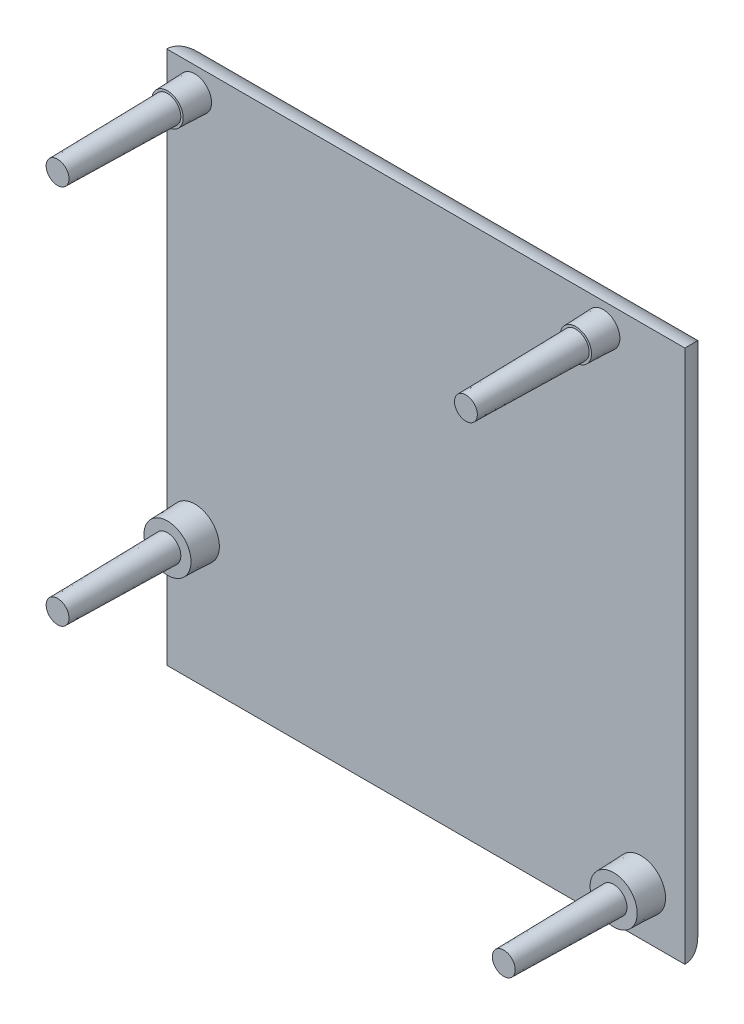
ISO-10303-21;
HEADER;
FILE_DESCRIPTION(('STEP AP214'),'2;1');
FILE_NAME('part.step','',(''),(''),'','','');
FILE_SCHEMA(('AUTOMOTIVE_DESIGN { 1 0 10303 214 1 1 1 1 }'));
ENDSEC;
DATA;
#1=APPLICATION_CONTEXT('core data for automotive mechanical design processes');
#2=APPLICATION_PROTOCOL_DEFINITION('international standard','automotive_design',2000,#1);
#3=PRODUCT_CONTEXT('',#1,'mechanical');
#4=PRODUCT('Part','Part','',(#3));
#5=PRODUCT_RELATED_PRODUCT_CATEGORY('part','',(#4));
#6=PRODUCT_DEFINITION_FORMATION('','',#4);
#7=PRODUCT_DEFINITION_CONTEXT('part definition',#1,'design');
#8=PRODUCT_DEFINITION('design','',#6,#7);
#9=PRODUCT_DEFINITION_SHAPE('','',#8);
#10=(LENGTH_UNIT() NAMED_UNIT(*) SI_UNIT(.MILLI.,.METRE.));
#11=(NAMED_UNIT(*) PLANE_ANGLE_UNIT() SI_UNIT($,.RADIAN.));
#12=(NAMED_UNIT(*) SI_UNIT($,.STERADIAN.) SOLID_ANGLE_UNIT());
#13=UNCERTAINTY_MEASURE_WITH_UNIT(LENGTH_MEASURE(1.E-05),#10,'distance_accuracy_value','');
#14=(GEOMETRIC_REPRESENTATION_CONTEXT(3) GLOBAL_UNCERTAINTY_ASSIGNED_CONTEXT((#13)) GLOBAL_UNIT_ASSIGNED_CONTEXT((#10,
#11,#12)) REPRESENTATION_CONTEXT('',''));
#15=CARTESIAN_POINT('',(0.,0.,0.));
#16=DIRECTION('',(0.,0.,1.));
#17=DIRECTION('',(1.,0.,0.));
#18=AXIS2_PLACEMENT_3D('',#15,#16,#17);
#19=CARTESIAN_POINT('',(0.,0.,2.));
#20=DIRECTION('',(0.,0.,-1.));
#21=DIRECTION('',(-1.,0.,0.));
#22=AXIS2_PLACEMENT_3D('',#19,#20,#21);
#23=PLANE('',#22);
#24=CARTESIAN_POINT('',(11.3,15.46,2.));
#25=DIRECTION('',(0.,0.,-1.));
#26=DIRECTION('',(-1.,0.,0.));
#27=AXIS2_PLACEMENT_3D('',#24,#25,#26);
#28=CIRCLE('',#27,1.06097166353259);
#29=CARTESIAN_POINT('',(10.2390283364674,15.46,2.));
#30=VERTEX_POINT('',#29);
#31=EDGE_CURVE('E141',#30,#30,#28,.F.);
#32=ORIENTED_EDGE('',*,*,#31,.F.);
#33=EDGE_LOOP('',(#32));
#34=FACE_BOUND('',#33,.T.);
#35=CARTESIAN_POINT('',(-14.71,15.46,2.));
#36=DIRECTION('',(0.,0.,-1.));
#37=DIRECTION('',(-1.,0.,0.));
#38=AXIS2_PLACEMENT_3D('',#35,#36,#37);
#39=CIRCLE('',#38,1.06097166353259);
#40=CARTESIAN_POINT('',(-15.7709716635326,15.46,2.));
#41=VERTEX_POINT('',#40);
#42=EDGE_CURVE('E134',#41,#41,#39,.F.);
#43=ORIENTED_EDGE('',*,*,#42,.F.);
#44=EDGE_LOOP('',(#43));
#45=FACE_BOUND('',#44,.T.);
#46=CARTESIAN_POINT('',(-14.71,-8.77,2.));
#47=DIRECTION('',(0.,0.,-1.));
#48=DIRECTION('',(-1.,0.,0.));
#49=AXIS2_PLACEMENT_3D('',#46,#47,#48);
#50=CIRCLE('',#49,1.56097166353259);
#51=CARTESIAN_POINT('',(-16.2709716635326,-8.77,2.));
#52=VERTEX_POINT('',#51);
#53=EDGE_CURVE('E150',#52,#52,#50,.F.);
#54=ORIENTED_EDGE('',*,*,#53,.F.);
#55=EDGE_LOOP('',(#54));
#56=FACE_BOUND('',#55,.T.);
#57=CARTESIAN_POINT('',(13.71,-13.96,2.));
#58=DIRECTION('',(0.,0.,-1.));
#59=DIRECTION('',(-1.,0.,0.));
#60=AXIS2_PLACEMENT_3D('',#57,#58,#59);
#61=CIRCLE('',#60,1.56097166353259);
#62=CARTESIAN_POINT('',(12.1490283364674,-13.96,2.));
#63=VERTEX_POINT('',#62);
#64=EDGE_CURVE('E97',#63,#63,#61,.F.);
#65=ORIENTED_EDGE('',*,*,#64,.F.);
#66=EDGE_LOOP('',(#65));
#67=FACE_BOUND('',#66,.T.);
#68=DIRECTION('',(1.,0.,0.));
#69=VECTOR('',#68,1.);
#70=CARTESIAN_POINT('',(-16.5,17.,2.));
#71=LINE('',#70,#69);
#72=CARTESIAN_POINT('',(-16.5,17.,2.));
#73=VERTEX_POINT('',#72);
#74=CARTESIAN_POINT('',(16.5,17.,2.));
#75=VERTEX_POINT('',#74);
#76=EDGE_CURVE('E79',#73,#75,#71,.T.);
#77=ORIENTED_EDGE('',*,*,#76,.F.);
#78=DIRECTION('',(0.,-1.,0.));
#79=VECTOR('',#78,1.);
#80=CARTESIAN_POINT('',(-16.5,17.,2.));
#81=LINE('',#80,#79);
#82=CARTESIAN_POINT('',(-16.5,-17.,2.));
#83=VERTEX_POINT('',#82);
#84=EDGE_CURVE('E101',#73,#83,#81,.T.);
#85=ORIENTED_EDGE('',*,*,#84,.T.);
#86=DIRECTION('',(1.,0.,0.));
#87=VECTOR('',#86,1.);
#88=CARTESIAN_POINT('',(-16.5,-17.,2.));
#89=LINE('',#88,#87);
#90=CARTESIAN_POINT('',(16.5,-17.,2.));
#91=VERTEX_POINT('',#90);
#92=EDGE_CURVE('E82',#83,#91,#89,.T.);
#93=ORIENTED_EDGE('',*,*,#92,.T.);
#94=DIRECTION('',(0.,-1.,0.));
#95=VECTOR('',#94,1.);
#96=CARTESIAN_POINT('',(16.5,17.,2.));
#97=LINE('',#96,#95);
#98=EDGE_CURVE('E75',#75,#91,#97,.T.);
#99=ORIENTED_EDGE('',*,*,#98,.F.);
#100=EDGE_LOOP('',(#77,#85,#93,#99));
#101=FACE_BOUND('',#100,.T.);
#102=ADVANCED_FACE('F35',(#34,#45,#56,#67,#101),#23,.F.);
#103=CARTESIAN_POINT('',(0.,0.,0.));
#104=DIRECTION('',(0.,0.,-1.));
#105=DIRECTION('',(-1.,0.,0.));
#106=AXIS2_PLACEMENT_3D('',#103,#104,#105);
#107=PLANE('',#106);
#108=DIRECTION('',(1.,0.,0.));
#109=VECTOR('',#108,1.);
#110=CARTESIAN_POINT('',(-16.5,-15.,0.));
#111=LINE('',#110,#109);
#112=CARTESIAN_POINT('',(14.5,-15.,0.));
#113=VERTEX_POINT('',#112);
#114=CARTESIAN_POINT('',(-14.5,-15.,0.));
#115=VERTEX_POINT('',#114);
#116=EDGE_CURVE('E50',#113,#115,#111,.F.);
#117=ORIENTED_EDGE('',*,*,#116,.T.);
#118=DIRECTION('',(0.,-1.,0.));
#119=VECTOR('',#118,1.);
#120=CARTESIAN_POINT('',(-14.5,17.,0.));
#121=LINE('',#120,#119);
#122=CARTESIAN_POINT('',(-14.5,15.,0.));
#123=VERTEX_POINT('',#122);
#124=EDGE_CURVE('E107',#115,#123,#121,.F.);
#125=ORIENTED_EDGE('',*,*,#124,.T.);
#126=DIRECTION('',(1.,0.,0.));
#127=VECTOR('',#126,1.);
#128=CARTESIAN_POINT('',(0.,15.,0.));
#129=LINE('',#128,#127);
#130=CARTESIAN_POINT('',(14.5,15.,0.));
#131=VERTEX_POINT('',#130);
#132=EDGE_CURVE('E103',#123,#131,#129,.T.);
#133=ORIENTED_EDGE('',*,*,#132,.T.);
#134=DIRECTION('',(0.,-1.,0.));
#135=VECTOR('',#134,1.);
#136=CARTESIAN_POINT('',(14.5,0.,0.));
#137=LINE('',#136,#135);
#138=EDGE_CURVE('E55',#131,#113,#137,.T.);
#139=ORIENTED_EDGE('',*,*,#138,.T.);
#140=EDGE_LOOP('',(#117,#125,#133,#139));
#141=FACE_BOUND('',#140,.T.);
#142=ADVANCED_FACE('F165',(#141),#107,.T.);
#143=CARTESIAN_POINT('',(14.5,0.,2.));
#144=DIRECTION('',(0.,-1.,0.));
#145=DIRECTION('',(1.,0.,0.));
#146=AXIS2_PLACEMENT_3D('',#143,#144,#145);
#147=CYLINDRICAL_SURFACE('',#146,2.);
#148=CARTESIAN_POINT('',(14.5,-15.,2.));
#149=DIRECTION('',(-0.707106781186547,-0.707106781186548,0.));
#150=DIRECTION('',(0.707106781186548,-0.707106781186547,0.));
#151=AXIS2_PLACEMENT_3D('',#148,#149,#150);
#152=ELLIPSE('',#151,2.82842712474619,2.);
#153=EDGE_CURVE('E90',#113,#91,#152,.T.);
#154=ORIENTED_EDGE('',*,*,#153,.F.);
#155=ORIENTED_EDGE('',*,*,#138,.F.);
#156=CARTESIAN_POINT('',(14.5,15.,2.));
#157=DIRECTION('',(0.707106781186548,-0.707106781186547,0.));
#158=DIRECTION('',(0.707106781186547,0.707106781186548,0.));
#159=AXIS2_PLACEMENT_3D('',#156,#157,#158);
#160=ELLIPSE('',#159,2.82842712474619,2.);
#161=EDGE_CURVE('E87',#75,#131,#160,.F.);
#162=ORIENTED_EDGE('',*,*,#161,.F.);
#163=ORIENTED_EDGE('',*,*,#98,.T.);
#164=EDGE_LOOP('',(#154,#155,#162,#163));
#165=FACE_BOUND('',#164,.T.);
#166=ADVANCED_FACE('F37',(#165),#147,.T.);
#167=CARTESIAN_POINT('',(0.,15.,2.));
#168=DIRECTION('',(1.,0.,0.));
#169=DIRECTION('',(0.,0.,-1.));
#170=AXIS2_PLACEMENT_3D('',#167,#168,#169);
#171=CYLINDRICAL_SURFACE('',#170,2.);
#172=ORIENTED_EDGE('',*,*,#161,.T.);
#173=ORIENTED_EDGE('',*,*,#132,.F.);
#174=CARTESIAN_POINT('',(-14.5,15.,2.));
#175=DIRECTION('',(0.707106781186547,0.707106781186548,0.));
#176=DIRECTION('',(0.707106781186548,-0.707106781186547,0.));
#177=AXIS2_PLACEMENT_3D('',#174,#175,#176);
#178=ELLIPSE('',#177,2.82842712474619,2.);
#179=EDGE_CURVE('E93',#73,#123,#178,.F.);
#180=ORIENTED_EDGE('',*,*,#179,.F.);
#181=ORIENTED_EDGE('',*,*,#76,.T.);
#182=EDGE_LOOP('',(#172,#173,#180,#181));
#183=FACE_BOUND('',#182,.T.);
#184=ADVANCED_FACE('F92',(#183),#171,.T.);
#185=CARTESIAN_POINT('',(-16.5,-15.,2.));
#186=DIRECTION('',(-1.,0.,0.));
#187=DIRECTION('',(0.,0.,1.));
#188=AXIS2_PLACEMENT_3D('',#185,#186,#187);
#189=CYLINDRICAL_SURFACE('',#188,2.);
#190=ORIENTED_EDGE('',*,*,#153,.T.);
#191=ORIENTED_EDGE('',*,*,#92,.F.);
#192=CARTESIAN_POINT('',(-14.5,-15.,2.));
#193=DIRECTION('',(-0.707106781186548,0.707106781186547,0.));
#194=DIRECTION('',(-0.707106781186547,-0.707106781186548,0.));
#195=AXIS2_PLACEMENT_3D('',#192,#193,#194);
#196=ELLIPSE('',#195,2.82842712474619,2.);
#197=EDGE_CURVE('E110',#115,#83,#196,.T.);
#198=ORIENTED_EDGE('',*,*,#197,.F.);
#199=ORIENTED_EDGE('',*,*,#116,.F.);
#200=EDGE_LOOP('',(#190,#191,#198,#199));
#201=FACE_BOUND('',#200,.T.);
#202=ADVANCED_FACE('F181',(#201),#189,.T.);
#203=CARTESIAN_POINT('',(-14.5,17.,2.));
#204=DIRECTION('',(0.,1.,0.));
#205=DIRECTION('',(-1.,0.,0.));
#206=AXIS2_PLACEMENT_3D('',#203,#204,#205);
#207=CYLINDRICAL_SURFACE('',#206,2.);
#208=ORIENTED_EDGE('',*,*,#179,.T.);
#209=ORIENTED_EDGE('',*,*,#124,.F.);
#210=ORIENTED_EDGE('',*,*,#197,.T.);
#211=ORIENTED_EDGE('',*,*,#84,.F.);
#212=EDGE_LOOP('',(#208,#209,#210,#211));
#213=FACE_BOUND('',#212,.T.);
#214=ADVANCED_FACE('F177',(#213),#207,.T.);
#215=CARTESIAN_POINT('',(13.71,-13.96,3.74600000000003));
#216=DIRECTION('',(0.,0.,1.));
#217=DIRECTION('',(-0.894427190999916,0.447213595499958,0.));
#218=AXIS2_PLACEMENT_3D('',#215,#216,#217);
#219=PLANE('',#218);
#220=CARTESIAN_POINT('',(13.71,-13.96,3.74600000000003));
#221=DIRECTION('',(0.,0.,1.));
#222=DIRECTION('',(1.,0.,0.));
#223=AXIS2_PLACEMENT_3D('',#220,#221,#222);
#224=CIRCLE('',#223,0.85);
#225=CARTESIAN_POINT('',(14.56,-13.96,3.74600000000003));
#226=VERTEX_POINT('',#225);
#227=EDGE_CURVE('E109',#226,#226,#224,.T.);
#228=ORIENTED_EDGE('',*,*,#227,.F.);
#229=EDGE_LOOP('',(#228));
#230=FACE_BOUND('',#229,.T.);
#231=CARTESIAN_POINT('',(13.71,-13.96,3.74600000000003));
#232=DIRECTION('',(0.,0.,-1.));
#233=DIRECTION('',(0.894427190999916,-0.447213595499958,0.));
#234=AXIS2_PLACEMENT_3D('',#231,#232,#233);
#235=CIRCLE('',#234,1.5);
#236=CARTESIAN_POINT('',(15.0516407864999,-14.6308203932499,3.74600000000003));
#237=VERTEX_POINT('',#236);
#238=EDGE_CURVE('E155',#237,#237,#235,.T.);
#239=ORIENTED_EDGE('',*,*,#238,.F.);
#240=EDGE_LOOP('',(#239));
#241=FACE_BOUND('',#240,.T.);
#242=ADVANCED_FACE('F180',(#230,#241),#219,.T.);
#243=CARTESIAN_POINT('',(13.71,-13.96,3.74600000000003));
#244=DIRECTION('',(0.,0.,-1.));
#245=DIRECTION('',(0.894427190999916,-0.447213595499958,0.));
#246=AXIS2_PLACEMENT_3D('',#243,#244,#245);
#247=CONICAL_SURFACE('',#246,1.5,0.0349065850398865);
#248=ORIENTED_EDGE('',*,*,#238,.T.);
#249=EDGE_LOOP('',(#248));
#250=FACE_BOUND('',#249,.T.);
#251=ORIENTED_EDGE('',*,*,#64,.T.);
#252=EDGE_LOOP('',(#251));
#253=FACE_BOUND('',#252,.T.);
#254=ADVANCED_FACE('F162',(#250,#253),#247,.T.);
#255=CARTESIAN_POINT('',(13.71,-13.96,10.746));
#256=DIRECTION('',(0.,0.,1.));
#257=DIRECTION('',(-0.894427190999916,0.447213595499958,0.));
#258=AXIS2_PLACEMENT_3D('',#255,#256,#257);
#259=PLANE('',#258);
#260=CARTESIAN_POINT('',(13.71,-13.96,10.746));
#261=DIRECTION('',(0.,0.,-1.));
#262=DIRECTION('',(0.894427190999916,-0.447213595499958,0.));
#263=AXIS2_PLACEMENT_3D('',#260,#261,#262);
#264=CIRCLE('',#263,0.727814545502465);
#265=CARTESIAN_POINT('',(14.3609771195026,-14.2854885597513,10.746));
#266=VERTEX_POINT('',#265);
#267=EDGE_CURVE('E153',#266,#266,#264,.T.);
#268=ORIENTED_EDGE('',*,*,#267,.F.);
#269=EDGE_LOOP('',(#268));
#270=FACE_BOUND('',#269,.T.);
#271=ADVANCED_FACE('F231',(#270),#259,.T.);
#272=CARTESIAN_POINT('',(13.71,-13.96,10.746));
#273=DIRECTION('',(0.,0.,-1.));
#274=DIRECTION('',(0.894427190999916,-0.447213595499958,0.));
#275=AXIS2_PLACEMENT_3D('',#272,#273,#274);
#276=CONICAL_SURFACE('',#275,0.727814545502465,0.0174532925199449);
#277=ORIENTED_EDGE('',*,*,#227,.T.);
#278=EDGE_LOOP('',(#277));
#279=FACE_BOUND('',#278,.T.);
#280=ORIENTED_EDGE('',*,*,#267,.T.);
#281=EDGE_LOOP('',(#280));
#282=FACE_BOUND('',#281,.T.);
#283=ADVANCED_FACE('F238',(#279,#282),#276,.T.);
#284=CARTESIAN_POINT('',(-14.71,-8.77,3.74600000000003));
#285=DIRECTION('',(0.,0.,1.));
#286=DIRECTION('',(-0.894427190999916,0.447213595499958,0.));
#287=AXIS2_PLACEMENT_3D('',#284,#285,#286);
#288=PLANE('',#287);
#289=CARTESIAN_POINT('',(-14.71,-8.77,3.74600000000003));
#290=DIRECTION('',(0.,0.,1.));
#291=DIRECTION('',(1.,0.,0.));
#292=AXIS2_PLACEMENT_3D('',#289,#290,#291);
#293=CIRCLE('',#292,0.85);
#294=CARTESIAN_POINT('',(-13.86,-8.77,3.74600000000003));
#295=VERTEX_POINT('',#294);
#296=EDGE_CURVE('E116',#295,#295,#293,.T.);
#297=ORIENTED_EDGE('',*,*,#296,.F.);
#298=EDGE_LOOP('',(#297));
#299=FACE_BOUND('',#298,.T.);
#300=CARTESIAN_POINT('',(-14.71,-8.77,3.74600000000003));
#301=DIRECTION('',(0.,0.,-1.));
#302=DIRECTION('',(0.894427190999916,-0.447213595499958,0.));
#303=AXIS2_PLACEMENT_3D('',#300,#301,#302);
#304=CIRCLE('',#303,1.5);
#305=CARTESIAN_POINT('',(-13.3683592135001,-9.44082039324994,3.74600000000003));
#306=VERTEX_POINT('',#305);
#307=EDGE_CURVE('E147',#306,#306,#304,.T.);
#308=ORIENTED_EDGE('',*,*,#307,.F.);
#309=EDGE_LOOP('',(#308));
#310=FACE_BOUND('',#309,.T.);
#311=ADVANCED_FACE('F247',(#299,#310),#288,.T.);
#312=CARTESIAN_POINT('',(-14.71,-8.77,3.74600000000003));
#313=DIRECTION('',(0.,0.,-1.));
#314=DIRECTION('',(0.894427190999916,-0.447213595499958,0.));
#315=AXIS2_PLACEMENT_3D('',#312,#313,#314);
#316=CONICAL_SURFACE('',#315,1.5,0.0349065850398865);
#317=ORIENTED_EDGE('',*,*,#307,.T.);
#318=EDGE_LOOP('',(#317));
#319=FACE_BOUND('',#318,.T.);
#320=ORIENTED_EDGE('',*,*,#53,.T.);
#321=EDGE_LOOP('',(#320));
#322=FACE_BOUND('',#321,.T.);
#323=ADVANCED_FACE('F256',(#319,#322),#316,.T.);
#324=CARTESIAN_POINT('',(-14.71,-8.77,10.746));
#325=DIRECTION('',(0.,0.,1.));
#326=DIRECTION('',(-0.894427190999916,0.447213595499958,0.));
#327=AXIS2_PLACEMENT_3D('',#324,#325,#326);
#328=PLANE('',#327);
#329=CARTESIAN_POINT('',(-14.71,-8.77,10.746));
#330=DIRECTION('',(0.,0.,-1.));
#331=DIRECTION('',(0.894427190999916,-0.447213595499958,0.));
#332=AXIS2_PLACEMENT_3D('',#329,#330,#331);
#333=CIRCLE('',#332,0.727814545502465);
#334=CARTESIAN_POINT('',(-14.0590228804973,-9.09548855975133,10.746));
#335=VERTEX_POINT('',#334);
#336=EDGE_CURVE('E138',#335,#335,#333,.T.);
#337=ORIENTED_EDGE('',*,*,#336,.F.);
#338=EDGE_LOOP('',(#337));
#339=FACE_BOUND('',#338,.T.);
#340=ADVANCED_FACE('F265',(#339),#328,.T.);
#341=CARTESIAN_POINT('',(-14.71,-8.77,10.746));
#342=DIRECTION('',(0.,0.,-1.));
#343=DIRECTION('',(0.894427190999916,-0.447213595499958,0.));
#344=AXIS2_PLACEMENT_3D('',#341,#342,#343);
#345=CONICAL_SURFACE('',#344,0.727814545502465,0.0174532925199449);
#346=ORIENTED_EDGE('',*,*,#296,.T.);
#347=EDGE_LOOP('',(#346));
#348=FACE_BOUND('',#347,.T.);
#349=ORIENTED_EDGE('',*,*,#336,.T.);
#350=EDGE_LOOP('',(#349));
#351=FACE_BOUND('',#350,.T.);
#352=ADVANCED_FACE('F128',(#348,#351),#345,.T.);
#353=CARTESIAN_POINT('',(-14.71,15.46,3.74600000000003));
#354=DIRECTION('',(0.,0.,1.));
#355=DIRECTION('',(-0.894427190999916,0.447213595499958,0.));
#356=AXIS2_PLACEMENT_3D('',#353,#354,#355);
#357=PLANE('',#356);
#358=CARTESIAN_POINT('',(-14.71,15.46,3.74600000000003));
#359=DIRECTION('',(0.,0.,1.));
#360=DIRECTION('',(1.,0.,0.));
#361=AXIS2_PLACEMENT_3D('',#358,#359,#360);
#362=CIRCLE('',#361,0.85);
#363=CARTESIAN_POINT('',(-13.86,15.46,3.74600000000003));
#364=VERTEX_POINT('',#363);
#365=EDGE_CURVE('E43',#364,#364,#362,.T.);
#366=ORIENTED_EDGE('',*,*,#365,.F.);
#367=EDGE_LOOP('',(#366));
#368=FACE_BOUND('',#367,.T.);
#369=CARTESIAN_POINT('',(-14.71,15.46,3.74600000000003));
#370=DIRECTION('',(0.,0.,-1.));
#371=DIRECTION('',(0.894427190999916,-0.447213595499958,0.));
#372=AXIS2_PLACEMENT_3D('',#369,#370,#371);
#373=CIRCLE('',#372,1.);
#374=CARTESIAN_POINT('',(-13.8155728090001,15.0127864045,3.74600000000003));
#375=VERTEX_POINT('',#374);
#376=EDGE_CURVE('E132',#375,#375,#373,.T.);
#377=ORIENTED_EDGE('',*,*,#376,.F.);
#378=EDGE_LOOP('',(#377));
#379=FACE_BOUND('',#378,.T.);
#380=ADVANCED_FACE('F124',(#368,#379),#357,.T.);
#381=CARTESIAN_POINT('',(-14.71,15.46,3.74600000000003));
#382=DIRECTION('',(0.,0.,-1.));
#383=DIRECTION('',(0.894427190999916,-0.447213595499958,0.));
#384=AXIS2_PLACEMENT_3D('',#381,#382,#383);
#385=CONICAL_SURFACE('',#384,1.,0.0349065850398865);
#386=ORIENTED_EDGE('',*,*,#376,.T.);
#387=EDGE_LOOP('',(#386));
#388=FACE_BOUND('',#387,.T.);
#389=ORIENTED_EDGE('',*,*,#42,.T.);
#390=EDGE_LOOP('',(#389));
#391=FACE_BOUND('',#390,.T.);
#392=ADVANCED_FACE('F127',(#388,#391),#385,.T.);
#393=CARTESIAN_POINT('',(-14.71,15.46,10.746));
#394=DIRECTION('',(0.,0.,1.));
#395=DIRECTION('',(-0.894427190999916,0.447213595499958,0.));
#396=AXIS2_PLACEMENT_3D('',#393,#394,#395);
#397=PLANE('',#396);
#398=CARTESIAN_POINT('',(-14.71,15.46,10.746));
#399=DIRECTION('',(0.,0.,-1.));
#400=DIRECTION('',(0.894427190999916,-0.447213595499958,0.));
#401=AXIS2_PLACEMENT_3D('',#398,#399,#400);
#402=CIRCLE('',#401,0.727814545502465);
#403=CARTESIAN_POINT('',(-14.0590228804974,15.1345114402487,10.746));
#404=VERTEX_POINT('',#403);
#405=EDGE_CURVE('E135',#404,#404,#402,.T.);
#406=ORIENTED_EDGE('',*,*,#405,.F.);
#407=EDGE_LOOP('',(#406));
#408=FACE_BOUND('',#407,.T.);
#409=ADVANCED_FACE('F295',(#408),#397,.T.);
#410=CARTESIAN_POINT('',(-14.71,15.46,10.746));
#411=DIRECTION('',(0.,0.,-1.));
#412=DIRECTION('',(0.894427190999916,-0.447213595499958,0.));
#413=AXIS2_PLACEMENT_3D('',#410,#411,#412);
#414=CONICAL_SURFACE('',#413,0.727814545502465,0.0174532925199449);
#415=ORIENTED_EDGE('',*,*,#365,.T.);
#416=EDGE_LOOP('',(#415));
#417=FACE_BOUND('',#416,.T.);
#418=ORIENTED_EDGE('',*,*,#405,.T.);
#419=EDGE_LOOP('',(#418));
#420=FACE_BOUND('',#419,.T.);
#421=ADVANCED_FACE('F121',(#417,#420),#414,.T.);
#422=CARTESIAN_POINT('',(11.3,15.46,3.74600000000003));
#423=DIRECTION('',(0.,0.,1.));
#424=DIRECTION('',(-0.894427190999916,0.447213595499958,0.));
#425=AXIS2_PLACEMENT_3D('',#422,#423,#424);
#426=PLANE('',#425);
#427=CARTESIAN_POINT('',(11.3,15.46,3.74600000000003));
#428=DIRECTION('',(0.,0.,1.));
#429=DIRECTION('',(1.,0.,0.));
#430=AXIS2_PLACEMENT_3D('',#427,#428,#429);
#431=CIRCLE('',#430,0.85);
#432=CARTESIAN_POINT('',(12.15,15.46,3.74600000000003));
#433=VERTEX_POINT('',#432);
#434=EDGE_CURVE('E11',#433,#433,#431,.T.);
#435=ORIENTED_EDGE('',*,*,#434,.F.);
#436=EDGE_LOOP('',(#435));
#437=FACE_BOUND('',#436,.T.);
#438=CARTESIAN_POINT('',(11.3,15.46,3.74600000000003));
#439=DIRECTION('',(0.,0.,-1.));
#440=DIRECTION('',(0.894427190999916,-0.447213595499958,0.));
#441=AXIS2_PLACEMENT_3D('',#438,#439,#440);
#442=CIRCLE('',#441,1.);
#443=CARTESIAN_POINT('',(12.1944271909999,15.0127864045,3.74600000000003));
#444=VERTEX_POINT('',#443);
#445=EDGE_CURVE('E371',#444,#444,#442,.T.);
#446=ORIENTED_EDGE('',*,*,#445,.F.);
#447=EDGE_LOOP('',(#446));
#448=FACE_BOUND('',#447,.T.);
#449=ADVANCED_FACE('F311',(#437,#448),#426,.T.);
#450=CARTESIAN_POINT('',(11.3,15.46,3.74600000000003));
#451=DIRECTION('',(0.,0.,-1.));
#452=DIRECTION('',(0.894427190999916,-0.447213595499958,0.));
#453=AXIS2_PLACEMENT_3D('',#450,#451,#452);
#454=CONICAL_SURFACE('',#453,1.,0.0349065850398865);
#455=ORIENTED_EDGE('',*,*,#445,.T.);
#456=EDGE_LOOP('',(#455));
#457=FACE_BOUND('',#456,.T.);
#458=ORIENTED_EDGE('',*,*,#31,.T.);
#459=EDGE_LOOP('',(#458));
#460=FACE_BOUND('',#459,.T.);
#461=ADVANCED_FACE('F319',(#457,#460),#454,.T.);
#462=CARTESIAN_POINT('',(11.3,15.46,10.746));
#463=DIRECTION('',(0.,0.,1.));
#464=DIRECTION('',(-0.894427190999916,0.447213595499958,0.));
#465=AXIS2_PLACEMENT_3D('',#462,#463,#464);
#466=PLANE('',#465);
#467=CARTESIAN_POINT('',(11.3,15.46,10.746));
#468=DIRECTION('',(0.,0.,-1.));
#469=DIRECTION('',(0.894427190999916,-0.447213595499958,0.));
#470=AXIS2_PLACEMENT_3D('',#467,#468,#469);
#471=CIRCLE('',#470,0.727814545502465);
#472=CARTESIAN_POINT('',(11.9509771195026,15.1345114402487,10.746));
#473=VERTEX_POINT('',#472);
#474=EDGE_CURVE('E370',#473,#473,#471,.T.);
#475=ORIENTED_EDGE('',*,*,#474,.F.);
#476=EDGE_LOOP('',(#475));
#477=FACE_BOUND('',#476,.T.);
#478=ADVANCED_FACE('F328',(#477),#466,.T.);
#479=CARTESIAN_POINT('',(11.3,15.46,10.746));
#480=DIRECTION('',(0.,0.,-1.));
#481=DIRECTION('',(0.894427190999916,-0.447213595499958,0.));
#482=AXIS2_PLACEMENT_3D('',#479,#480,#481);
#483=CONICAL_SURFACE('',#482,0.727814545502465,0.0174532925199449);
#484=ORIENTED_EDGE('',*,*,#434,.T.);
#485=EDGE_LOOP('',(#484));
#486=FACE_BOUND('',#485,.T.);
#487=ORIENTED_EDGE('',*,*,#474,.T.);
#488=EDGE_LOOP('',(#487));
#489=FACE_BOUND('',#488,.T.);
#490=ADVANCED_FACE('F337',(#486,#489),#483,.T.);
#491=CLOSED_SHELL('',(#102,#142,#166,#184,#202,#214,#242,#254,#271,#283,#311,#323,#340,#352,
#380,#392,#409,#421,#449,#461,#478,#490));
#492=MANIFOLD_SOLID_BREP('B2',#491);
#493=ADVANCED_BREP_SHAPE_REPRESENTATION('',(#18,#492),#14);
#494=SHAPE_DEFINITION_REPRESENTATION(#9,#493);
ENDSEC;
END-ISO-10303-21;
